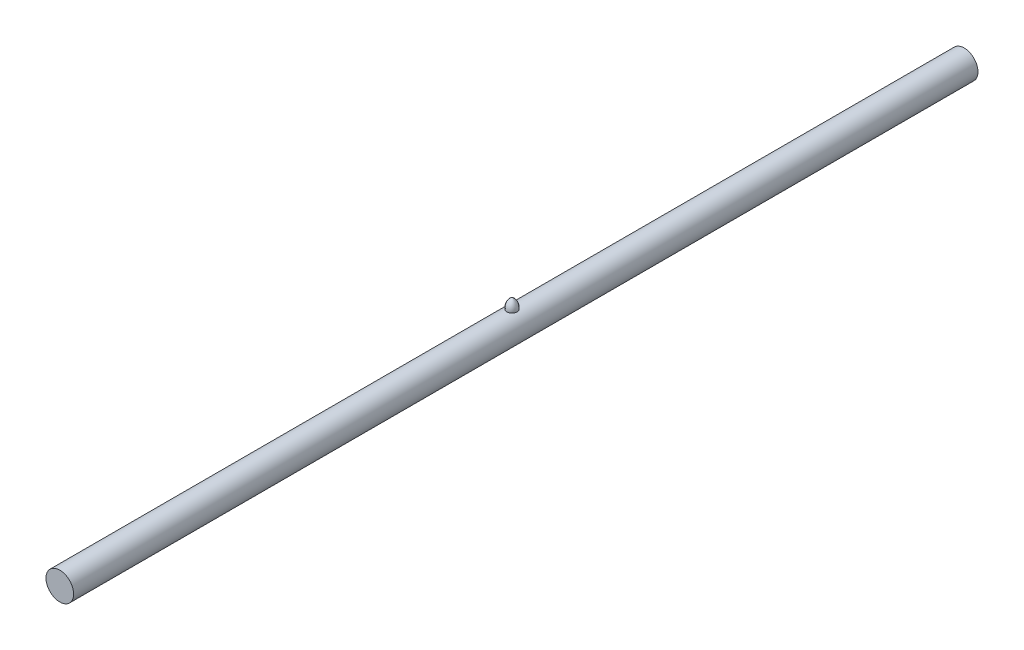
ISO-10303-21;
HEADER;
FILE_DESCRIPTION(('STEP AP214'),'2;1');
FILE_NAME('part.step','',(''),(''),'','','');
FILE_SCHEMA(('AUTOMOTIVE_DESIGN { 1 0 10303 214 1 1 1 1 }'));
ENDSEC;
DATA;
#1=APPLICATION_CONTEXT('core data for automotive mechanical design processes');
#2=APPLICATION_PROTOCOL_DEFINITION('international standard','automotive_design',2000,#1);
#3=PRODUCT_CONTEXT('',#1,'mechanical');
#4=PRODUCT('Part','Part','',(#3));
#5=PRODUCT_RELATED_PRODUCT_CATEGORY('part','',(#4));
#6=PRODUCT_DEFINITION_FORMATION('','',#4);
#7=PRODUCT_DEFINITION_CONTEXT('part definition',#1,'design');
#8=PRODUCT_DEFINITION('design','',#6,#7);
#9=PRODUCT_DEFINITION_SHAPE('','',#8);
#10=(LENGTH_UNIT() NAMED_UNIT(*) SI_UNIT(.MILLI.,.METRE.));
#11=(NAMED_UNIT(*) PLANE_ANGLE_UNIT() SI_UNIT($,.RADIAN.));
#12=(NAMED_UNIT(*) SI_UNIT($,.STERADIAN.) SOLID_ANGLE_UNIT());
#13=UNCERTAINTY_MEASURE_WITH_UNIT(LENGTH_MEASURE(1.E-05),#10,'distance_accuracy_value','');
#14=(GEOMETRIC_REPRESENTATION_CONTEXT(3) GLOBAL_UNCERTAINTY_ASSIGNED_CONTEXT((#13)) GLOBAL_UNIT_ASSIGNED_CONTEXT((#10,
#11,#12)) REPRESENTATION_CONTEXT('',''));
#15=CARTESIAN_POINT('',(0.,0.,0.));
#16=DIRECTION('',(0.,0.,1.));
#17=DIRECTION('',(1.,0.,0.));
#18=AXIS2_PLACEMENT_3D('',#15,#16,#17);
#19=CARTESIAN_POINT('',(0.,3.49249999999999,113.03));
#20=DIRECTION('',(0.,1.,0.));
#21=DIRECTION('',(0.,0.,1.));
#22=AXIS2_PLACEMENT_3D('',#19,#20,#21);
#23=PLANE('',#22);
#24=CARTESIAN_POINT('',(0.,3.49249999999999,114.3));
#25=DIRECTION('',(0.,1.,0.));
#26=DIRECTION('',(0.,0.,1.));
#27=AXIS2_PLACEMENT_3D('',#24,#25,#26);
#28=CIRCLE('',#27,1.26999999999999);
#29=CARTESIAN_POINT('',(0.,3.49249999999999,115.57));
#30=VERTEX_POINT('',#29);
#31=EDGE_CURVE('E12',#30,#30,#28,.T.);
#32=ORIENTED_EDGE('',*,*,#31,.F.);
#33=EDGE_LOOP('',(#32));
#34=FACE_BOUND('',#33,.T.);
#35=ADVANCED_FACE('F41',(#34),#23,.F.);
#36=CARTESIAN_POINT('',(0.,3.82064279213885,113.051285584278));
#37=DIRECTION('',(-1.,0.,0.));
#38=DIRECTION('',(0.,0.,1.));
#39=AXIS2_PLACEMENT_3D('',#36,#37,#38);
#40=CIRCLE('',#39,2.54);
#41=TRIMMED_CURVE('',#40,(PARAMETER_VALUE(-1.05684738515043)),
(PARAMETER_VALUE(1.05684738515043)),.T.,.PARAMETER.);
#42=CARTESIAN_POINT('',(0.,3.82064279213885,114.3));
#43=DIRECTION('',(0.,1.,0.));
#44=AXIS1_PLACEMENT('',#42,#43);
#45=SURFACE_OF_REVOLUTION('',#41,#44);
#46=CARTESIAN_POINT('',(0.,6.0325,114.3));
#47=VERTEX_POINT('',#46);
#48=VERTEX_LOOP('',#47);
#49=FACE_BOUND('',#48,.T.);
#50=ORIENTED_EDGE('',*,*,#31,.T.);
#51=EDGE_LOOP('',(#50));
#52=FACE_BOUND('',#51,.T.);
#53=ADVANCED_FACE('F48',(#49,#52),#45,.T.);
#54=CLOSED_SHELL('',(#35,#53));
#55=MANIFOLD_SOLID_BREP('B2',#54);
#56=CARTESIAN_POINT('',(0.,0.,228.6));
#57=DIRECTION('',(0.,0.,-1.));
#58=DIRECTION('',(-1.,0.,0.));
#59=AXIS2_PLACEMENT_3D('',#56,#57,#58);
#60=CYLINDRICAL_SURFACE('',#59,3.4925);
#61=CARTESIAN_POINT('',(0.,0.,228.6));
#62=DIRECTION('',(0.,0.,1.));
#63=DIRECTION('',(1.,0.,0.));
#64=AXIS2_PLACEMENT_3D('',#61,#62,#63);
#65=CIRCLE('',#64,3.4925);
#66=CARTESIAN_POINT('',(3.4925,0.,228.6));
#67=VERTEX_POINT('',#66);
#68=EDGE_CURVE('E40',#67,#67,#65,.T.);
#69=ORIENTED_EDGE('',*,*,#68,.F.);
#70=EDGE_LOOP('',(#69));
#71=FACE_BOUND('',#70,.T.);
#72=CARTESIAN_POINT('',(0.,0.,0.));
#73=DIRECTION('',(0.,0.,1.));
#74=DIRECTION('',(1.,0.,0.));
#75=AXIS2_PLACEMENT_3D('',#72,#73,#74);
#76=CIRCLE('',#75,3.4925);
#77=CARTESIAN_POINT('',(3.4925,0.,0.));
#78=VERTEX_POINT('',#77);
#79=EDGE_CURVE('E72',#78,#78,#76,.T.);
#80=ORIENTED_EDGE('',*,*,#79,.T.);
#81=EDGE_LOOP('',(#80));
#82=FACE_BOUND('',#81,.T.);
#83=ADVANCED_FACE('F69',(#71,#82),#60,.T.);
#84=CARTESIAN_POINT('',(0.,0.,228.6));
#85=DIRECTION('',(0.,0.,1.));
#86=DIRECTION('',(1.,0.,0.));
#87=AXIS2_PLACEMENT_3D('',#84,#85,#86);
#88=PLANE('',#87);
#89=ORIENTED_EDGE('',*,*,#68,.T.);
#90=EDGE_LOOP('',(#89));
#91=FACE_BOUND('',#90,.T.);
#92=ADVANCED_FACE('F84',(#91),#88,.T.);
#93=CARTESIAN_POINT('',(0.,0.,0.));
#94=DIRECTION('',(0.,0.,1.));
#95=DIRECTION('',(1.,0.,0.));
#96=AXIS2_PLACEMENT_3D('',#93,#94,#95);
#97=PLANE('',#96);
#98=ORIENTED_EDGE('',*,*,#79,.F.);
#99=EDGE_LOOP('',(#98));
#100=FACE_BOUND('',#99,.T.);
#101=ADVANCED_FACE('F82',(#100),#97,.F.);
#102=CLOSED_SHELL('',(#83,#92,#101));
#103=MANIFOLD_SOLID_BREP('B6',#102);
#104=ADVANCED_BREP_SHAPE_REPRESENTATION('',(#18,#55,#103),#14);
#105=SHAPE_DEFINITION_REPRESENTATION(#9,#104);
ENDSEC;
END-ISO-10303-21;
